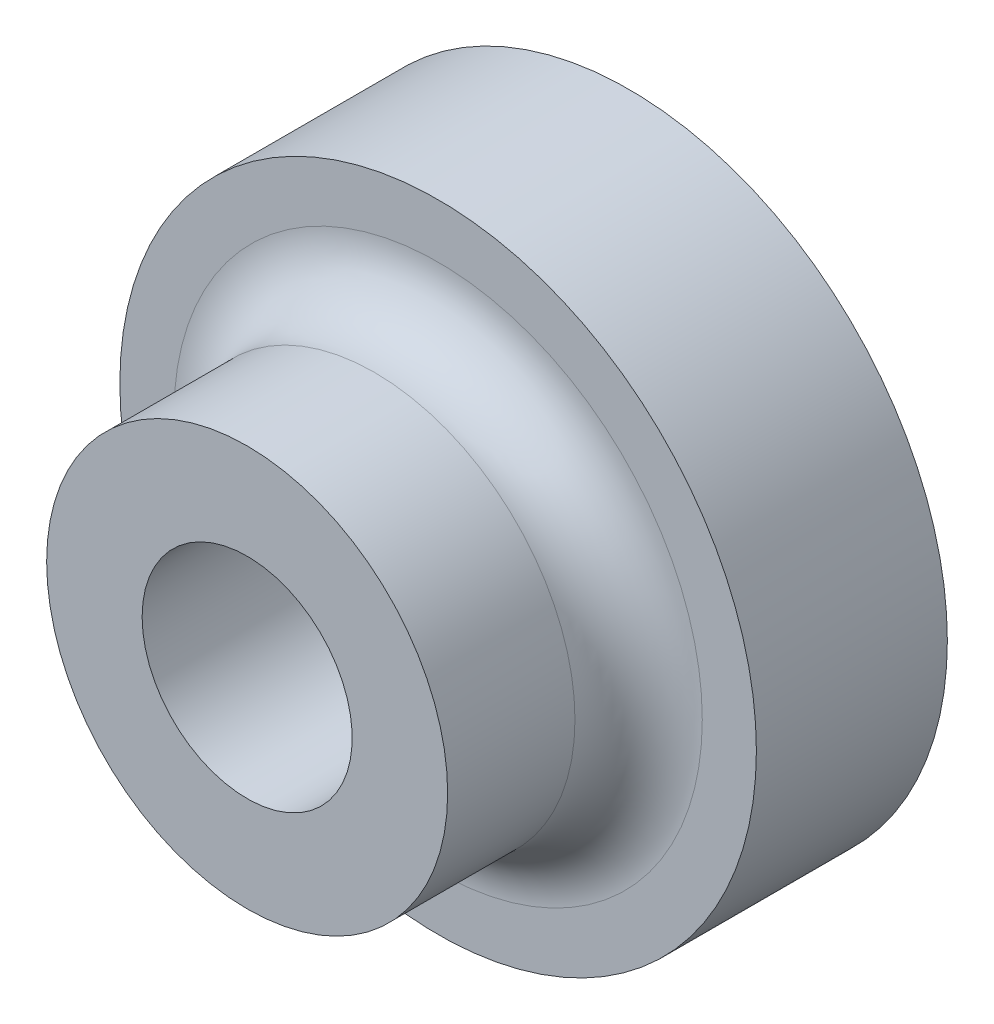
ISO-10303-21;
HEADER;
FILE_DESCRIPTION(('STEP AP214'),'2;1');
FILE_NAME('part.step','',(''),(''),'','','');
FILE_SCHEMA(('AUTOMOTIVE_DESIGN { 1 0 10303 214 1 1 1 1 }'));
ENDSEC;
DATA;
#1=APPLICATION_CONTEXT('core data for automotive mechanical design processes');
#2=APPLICATION_PROTOCOL_DEFINITION('international standard','automotive_design',2000,#1);
#3=PRODUCT_CONTEXT('',#1,'mechanical');
#4=PRODUCT('Part','Part','',(#3));
#5=PRODUCT_RELATED_PRODUCT_CATEGORY('part','',(#4));
#6=PRODUCT_DEFINITION_FORMATION('','',#4);
#7=PRODUCT_DEFINITION_CONTEXT('part definition',#1,'design');
#8=PRODUCT_DEFINITION('design','',#6,#7);
#9=PRODUCT_DEFINITION_SHAPE('','',#8);
#10=(LENGTH_UNIT() NAMED_UNIT(*) SI_UNIT(.MILLI.,.METRE.));
#11=(NAMED_UNIT(*) PLANE_ANGLE_UNIT() SI_UNIT($,.RADIAN.));
#12=(NAMED_UNIT(*) SI_UNIT($,.STERADIAN.) SOLID_ANGLE_UNIT());
#13=UNCERTAINTY_MEASURE_WITH_UNIT(LENGTH_MEASURE(1.E-05),#10,'distance_accuracy_value','');
#14=(GEOMETRIC_REPRESENTATION_CONTEXT(3) GLOBAL_UNCERTAINTY_ASSIGNED_CONTEXT((#13)) GLOBAL_UNIT_ASSIGNED_CONTEXT((#10,
#11,#12)) REPRESENTATION_CONTEXT('',''));
#15=CARTESIAN_POINT('',(0.,0.,0.));
#16=DIRECTION('',(0.,0.,1.));
#17=DIRECTION('',(1.,0.,0.));
#18=AXIS2_PLACEMENT_3D('',#15,#16,#17);
#19=CARTESIAN_POINT('',(0.,0.,3.001));
#20=DIRECTION('',(0.,0.,-1.));
#21=DIRECTION('',(-1.,0.,0.));
#22=AXIS2_PLACEMENT_3D('',#19,#20,#21);
#23=CYLINDRICAL_SURFACE('',#22,1.65);
#24=CARTESIAN_POINT('',(0.,0.,3.));
#25=DIRECTION('',(0.,0.,1.));
#26=DIRECTION('',(1.,0.,0.));
#27=AXIS2_PLACEMENT_3D('',#24,#25,#26);
#28=CIRCLE('',#27,1.65);
#29=CARTESIAN_POINT('',(-1.65,0.,3.));
#30=VERTEX_POINT('',#29);
#31=EDGE_CURVE('E60',#30,#30,#28,.F.);
#32=CARTESIAN_POINT('',(0.,0.,-0.5));
#33=DIRECTION('',(0.,0.,-1.));
#34=DIRECTION('',(-1.,0.,0.));
#35=AXIS2_PLACEMENT_3D('',#32,#33,#34);
#36=CIRCLE('',#35,1.65);
#37=CARTESIAN_POINT('',(-1.65,0.,-0.5));
#38=VERTEX_POINT('',#37);
#39=EDGE_CURVE('E43',#38,#38,#36,.F.);
#40=CARTESIAN_POINT('',(-1.65,0.,3.));
#41=CARTESIAN_POINT('',(-1.65,0.,2.96354166666667));
#42=CARTESIAN_POINT('',(-1.65,0.,2.92708333333333));
#43=CARTESIAN_POINT('',(-1.65,0.,2.85416666666667));
#44=CARTESIAN_POINT('',(-1.65,0.,2.81770833333333));
#45=CARTESIAN_POINT('',(-1.65,0.,2.74479166666667));
#46=CARTESIAN_POINT('',(-1.65,0.,2.70833333333333));
#47=CARTESIAN_POINT('',(-1.65,0.,2.63541666666667));
#48=CARTESIAN_POINT('',(-1.65,0.,2.59895833333333));
#49=CARTESIAN_POINT('',(-1.65,0.,2.52604166666667));
#50=CARTESIAN_POINT('',(-1.65,0.,2.48958333333333));
#51=CARTESIAN_POINT('',(-1.65,0.,2.41666666666667));
#52=CARTESIAN_POINT('',(-1.65,0.,2.38020833333333));
#53=CARTESIAN_POINT('',(-1.65,0.,2.30729166666667));
#54=CARTESIAN_POINT('',(-1.65,0.,2.27083333333333));
#55=CARTESIAN_POINT('',(-1.65,0.,2.19791666666667));
#56=CARTESIAN_POINT('',(-1.65,0.,2.16145833333333));
#57=CARTESIAN_POINT('',(-1.65,0.,2.08854166666667));
#58=CARTESIAN_POINT('',(-1.65,0.,2.05208333333333));
#59=CARTESIAN_POINT('',(-1.65,0.,1.97916666666667));
#60=CARTESIAN_POINT('',(-1.65,0.,1.94270833333333));
#61=CARTESIAN_POINT('',(-1.65,0.,1.86979166666667));
#62=CARTESIAN_POINT('',(-1.65,0.,1.83333333333333));
#63=CARTESIAN_POINT('',(-1.65,0.,1.76041666666667));
#64=CARTESIAN_POINT('',(-1.65,0.,1.72395833333333));
#65=CARTESIAN_POINT('',(-1.65,0.,1.65104166666667));
#66=CARTESIAN_POINT('',(-1.65,0.,1.61458333333333));
#67=CARTESIAN_POINT('',(-1.65,0.,1.54166666666667));
#68=CARTESIAN_POINT('',(-1.65,0.,1.50520833333333));
#69=CARTESIAN_POINT('',(-1.65,0.,1.43229166666667));
#70=CARTESIAN_POINT('',(-1.65,0.,1.39583333333333));
#71=CARTESIAN_POINT('',(-1.65,0.,1.32291666666667));
#72=CARTESIAN_POINT('',(-1.65,0.,1.28645833333333));
#73=CARTESIAN_POINT('',(-1.65,0.,1.21354166666667));
#74=CARTESIAN_POINT('',(-1.65,0.,1.17708333333333));
#75=CARTESIAN_POINT('',(-1.65,0.,1.10416666666667));
#76=CARTESIAN_POINT('',(-1.65,0.,1.06770833333333));
#77=CARTESIAN_POINT('',(-1.65,0.,0.994791666666667));
#78=CARTESIAN_POINT('',(-1.65,0.,0.958333333333333));
#79=CARTESIAN_POINT('',(-1.65,0.,0.885416666666667));
#80=CARTESIAN_POINT('',(-1.65,0.,0.848958333333333));
#81=CARTESIAN_POINT('',(-1.65,0.,0.776041666666667));
#82=CARTESIAN_POINT('',(-1.65,0.,0.739583333333333));
#83=CARTESIAN_POINT('',(-1.65,0.,0.666666666666667));
#84=CARTESIAN_POINT('',(-1.65,0.,0.630208333333333));
#85=CARTESIAN_POINT('',(-1.65,0.,0.557291666666667));
#86=CARTESIAN_POINT('',(-1.65,0.,0.520833333333333));
#87=CARTESIAN_POINT('',(-1.65,0.,0.447916666666667));
#88=CARTESIAN_POINT('',(-1.65,0.,0.411458333333333));
#89=CARTESIAN_POINT('',(-1.65,0.,0.338541666666667));
#90=CARTESIAN_POINT('',(-1.65,0.,0.302083333333333));
#91=CARTESIAN_POINT('',(-1.65,0.,0.229166666666667));
#92=CARTESIAN_POINT('',(-1.65,0.,0.192708333333333));
#93=CARTESIAN_POINT('',(-1.65,0.,0.119791666666667));
#94=CARTESIAN_POINT('',(-1.65,0.,0.0833333333333334));
#95=CARTESIAN_POINT('',(-1.65,0.,0.0104166666666667));
#96=CARTESIAN_POINT('',(-1.65,0.,-0.0260416666666667));
#97=CARTESIAN_POINT('',(-1.65,0.,-0.0989583333333334));
#98=CARTESIAN_POINT('',(-1.65,0.,-0.135416666666667));
#99=CARTESIAN_POINT('',(-1.65,0.,-0.208333333333333));
#100=CARTESIAN_POINT('',(-1.65,0.,-0.244791666666667));
#101=CARTESIAN_POINT('',(-1.65,0.,-0.317708333333333));
#102=CARTESIAN_POINT('',(-1.65,0.,-0.354166666666667));
#103=CARTESIAN_POINT('',(-1.65,0.,-0.427083333333333));
#104=CARTESIAN_POINT('',(-1.65,0.,-0.463541666666667));
#105=CARTESIAN_POINT('',(-1.65,0.,-0.5));
#106=B_SPLINE_CURVE_WITH_KNOTS('',3,(#40,#41,#42,#43,#44,#45,#46,#47,#48,#49,#50,#51,#52,#53,
#54,#55,#56,#57,#58,#59,#60,#61,#62,#63,#64,#65,#66,#67,#68,#69,#70,#71,#72,#73,#74,#75,#76,#77,
#78,#79,#80,#81,#82,#83,#84,#85,#86,#87,#88,#89,#90,#91,#92,#93,#94,#95,#96,#97,#98,#99,#100,
#101,#102,#103,#104,#105),.UNSPECIFIED.,.F.,.F.,(4,2,2,2,2,2,2,2,2,2,2,2,2,2,2,2,2,2,2,2,2,2,2,
2,2,2,2,2,2,2,2,2,4),(0.,0.109375,0.21875,0.328125,0.4375,0.546875,0.65625,0.765625,
0.874999999999999,0.984375,1.09375,1.203125,1.3125,1.421875,1.53125,1.640625,1.75,1.859375,
1.96875,2.078125,2.1875,2.296875,2.40625,2.515625,2.625,2.734375,2.84375,2.953125,3.0625,
3.171875,3.28125,3.390625,3.5),.UNSPECIFIED.);
#107=EDGE_CURVE('BSEAM39',#30,#38,#106,.T.);
#108=ORIENTED_EDGE('',*,*,#31,.F.);
#109=ORIENTED_EDGE('',*,*,#39,.F.);
#110=ORIENTED_EDGE('',*,*,#107,.T.);
#111=ORIENTED_EDGE('',*,*,#107,.F.);
#112=EDGE_LOOP('',(#108,#110,#109,#111));
#113=FACE_BOUND('',#112,.T.);
#114=ADVANCED_FACE('F39',(#113),#23,.F.);
#115=CARTESIAN_POINT('',(0.,0.,3.));
#116=DIRECTION('',(0.,0.,-1.));
#117=DIRECTION('',(-1.,0.,0.));
#118=AXIS2_PLACEMENT_3D('',#115,#116,#117);
#119=CYLINDRICAL_SURFACE('',#118,3.15);
#120=CARTESIAN_POINT('',(0.,0.,1.));
#121=DIRECTION('',(0.,0.,-1.));
#122=DIRECTION('',(-1.,0.,0.));
#123=AXIS2_PLACEMENT_3D('',#120,#121,#122);
#124=CIRCLE('',#123,3.15);
#125=CARTESIAN_POINT('',(-3.15,0.,1.));
#126=VERTEX_POINT('',#125);
#127=EDGE_CURVE('E47',#126,#126,#124,.F.);
#128=ORIENTED_EDGE('',*,*,#127,.T.);
#129=EDGE_LOOP('',(#128));
#130=FACE_BOUND('',#129,.T.);
#131=CARTESIAN_POINT('',(0.,0.,3.));
#132=DIRECTION('',(0.,0.,1.));
#133=DIRECTION('',(1.,0.,0.));
#134=AXIS2_PLACEMENT_3D('',#131,#132,#133);
#135=CIRCLE('',#134,3.15);
#136=CARTESIAN_POINT('',(3.15,0.,3.));
#137=VERTEX_POINT('',#136);
#138=EDGE_CURVE('E51',#137,#137,#135,.T.);
#139=ORIENTED_EDGE('',*,*,#138,.F.);
#140=EDGE_LOOP('',(#139));
#141=FACE_BOUND('',#140,.T.);
#142=ADVANCED_FACE('F78',(#130,#141),#119,.T.);
#143=CARTESIAN_POINT('',(0.,0.,3.));
#144=DIRECTION('',(0.,0.,1.));
#145=DIRECTION('',(1.,0.,0.));
#146=AXIS2_PLACEMENT_3D('',#143,#144,#145);
#147=PLANE('',#146);
#148=ORIENTED_EDGE('',*,*,#31,.T.);
#149=EDGE_LOOP('',(#148));
#150=FACE_BOUND('',#149,.T.);
#151=ORIENTED_EDGE('',*,*,#138,.T.);
#152=EDGE_LOOP('',(#151));
#153=FACE_BOUND('',#152,.T.);
#154=ADVANCED_FACE('F86',(#150,#153),#147,.T.);
#155=CARTESIAN_POINT('',(0.,0.,-3.));
#156=DIRECTION('',(0.,0.,1.));
#157=DIRECTION('',(1.,0.,0.));
#158=AXIS2_PLACEMENT_3D('',#155,#156,#157);
#159=CYLINDRICAL_SURFACE('',#158,5.);
#160=CARTESIAN_POINT('',(0.,0.,-3.));
#161=DIRECTION('',(0.,0.,-1.));
#162=DIRECTION('',(-1.,0.,0.));
#163=AXIS2_PLACEMENT_3D('',#160,#161,#162);
#164=CIRCLE('',#163,5.);
#165=CARTESIAN_POINT('',(-5.,0.,-3.));
#166=VERTEX_POINT('',#165);
#167=EDGE_CURVE('E56',#166,#166,#164,.T.);
#168=ORIENTED_EDGE('',*,*,#167,.F.);
#169=EDGE_LOOP('',(#168));
#170=FACE_BOUND('',#169,.T.);
#171=CARTESIAN_POINT('',(0.,0.,0.));
#172=DIRECTION('',(0.,0.,-1.));
#173=DIRECTION('',(-1.,0.,0.));
#174=AXIS2_PLACEMENT_3D('',#171,#172,#173);
#175=CIRCLE('',#174,5.);
#176=CARTESIAN_POINT('',(-5.,0.,0.));
#177=VERTEX_POINT('',#176);
#178=EDGE_CURVE('E57',#177,#177,#175,.T.);
#179=ORIENTED_EDGE('',*,*,#178,.T.);
#180=EDGE_LOOP('',(#179));
#181=FACE_BOUND('',#180,.T.);
#182=ADVANCED_FACE('F96',(#170,#181),#159,.T.);
#183=CARTESIAN_POINT('',(0.,0.,-3.));
#184=DIRECTION('',(0.,0.,-1.));
#185=DIRECTION('',(-1.,0.,0.));
#186=AXIS2_PLACEMENT_3D('',#183,#184,#185);
#187=PLANE('',#186);
#188=CARTESIAN_POINT('',(0.,0.,-3.));
#189=DIRECTION('',(0.,0.,-1.));
#190=DIRECTION('',(-1.,0.,0.));
#191=AXIS2_PLACEMENT_3D('',#188,#189,#190);
#192=CIRCLE('',#191,3.);
#193=CARTESIAN_POINT('',(-3.,0.,-3.));
#194=VERTEX_POINT('',#193);
#195=EDGE_CURVE('E65',#194,#194,#192,.T.);
#196=ORIENTED_EDGE('',*,*,#195,.F.);
#197=EDGE_LOOP('',(#196));
#198=FACE_BOUND('',#197,.T.);
#199=ORIENTED_EDGE('',*,*,#167,.T.);
#200=EDGE_LOOP('',(#199));
#201=FACE_BOUND('',#200,.T.);
#202=ADVANCED_FACE('F93',(#198,#201),#187,.T.);
#203=CARTESIAN_POINT('',(0.,0.,0.));
#204=DIRECTION('',(0.,0.,-1.));
#205=DIRECTION('',(-1.,0.,0.));
#206=AXIS2_PLACEMENT_3D('',#203,#204,#205);
#207=PLANE('',#206);
#208=CARTESIAN_POINT('',(0.,0.,0.));
#209=DIRECTION('',(0.,0.,-1.));
#210=DIRECTION('',(-1.,0.,0.));
#211=AXIS2_PLACEMENT_3D('',#208,#209,#210);
#212=CIRCLE('',#211,4.15);
#213=CARTESIAN_POINT('',(-4.15,0.,0.));
#214=VERTEX_POINT('',#213);
#215=EDGE_CURVE('E10',#214,#214,#212,.T.);
#216=ORIENTED_EDGE('',*,*,#215,.T.);
#217=EDGE_LOOP('',(#216));
#218=FACE_BOUND('',#217,.T.);
#219=ORIENTED_EDGE('',*,*,#178,.F.);
#220=EDGE_LOOP('',(#219));
#221=FACE_BOUND('',#220,.T.);
#222=ADVANCED_FACE('F95',(#218,#221),#207,.F.);
#223=CARTESIAN_POINT('',(0.,0.,1.));
#224=DIRECTION('',(0.,0.,-1.));
#225=DIRECTION('',(-1.,0.,0.));
#226=AXIS2_PLACEMENT_3D('',#223,#224,#225);
#227=TOROIDAL_SURFACE('',#226,4.15,1.);
#228=ORIENTED_EDGE('',*,*,#215,.F.);
#229=EDGE_LOOP('',(#228));
#230=FACE_BOUND('',#229,.T.);
#231=ORIENTED_EDGE('',*,*,#127,.F.);
#232=EDGE_LOOP('',(#231));
#233=FACE_BOUND('',#232,.T.);
#234=ADVANCED_FACE('F41',(#230,#233),#227,.F.);
#235=CARTESIAN_POINT('',(0.,0.,-0.5));
#236=DIRECTION('',(0.,0.,-1.));
#237=DIRECTION('',(-1.,0.,0.));
#238=AXIS2_PLACEMENT_3D('',#235,#236,#237);
#239=PLANE('',#238);
#240=CARTESIAN_POINT('',(0.,0.,-0.5));
#241=DIRECTION('',(0.,0.,-1.));
#242=DIRECTION('',(-1.,0.,0.));
#243=AXIS2_PLACEMENT_3D('',#240,#241,#242);
#244=CIRCLE('',#243,3.);
#245=CARTESIAN_POINT('',(-3.,0.,-0.5));
#246=VERTEX_POINT('',#245);
#247=EDGE_CURVE('E68',#246,#246,#244,.T.);
#248=ORIENTED_EDGE('',*,*,#247,.T.);
#249=EDGE_LOOP('',(#248));
#250=FACE_BOUND('',#249,.T.);
#251=ORIENTED_EDGE('',*,*,#39,.T.);
#252=EDGE_LOOP('',(#251));
#253=FACE_BOUND('',#252,.T.);
#254=ADVANCED_FACE('F75',(#250,#253),#239,.T.);
#255=CARTESIAN_POINT('',(0.,0.,-0.5));
#256=DIRECTION('',(0.,0.,-1.));
#257=DIRECTION('',(-1.,0.,0.));
#258=AXIS2_PLACEMENT_3D('',#255,#256,#257);
#259=CYLINDRICAL_SURFACE('',#258,3.);
#260=ORIENTED_EDGE('',*,*,#247,.F.);
#261=EDGE_LOOP('',(#260));
#262=FACE_BOUND('',#261,.T.);
#263=ORIENTED_EDGE('',*,*,#195,.T.);
#264=EDGE_LOOP('',(#263));
#265=FACE_BOUND('',#264,.T.);
#266=ADVANCED_FACE('F91',(#262,#265),#259,.F.);
#267=CLOSED_SHELL('',(#114,#142,#154,#182,#202,#222,#234,#254,#266));
#268=MANIFOLD_SOLID_BREP('B2',#267);
#269=ADVANCED_BREP_SHAPE_REPRESENTATION('',(#18,#268),#14);
#270=SHAPE_DEFINITION_REPRESENTATION(#9,#269);
ENDSEC;
END-ISO-10303-21;
